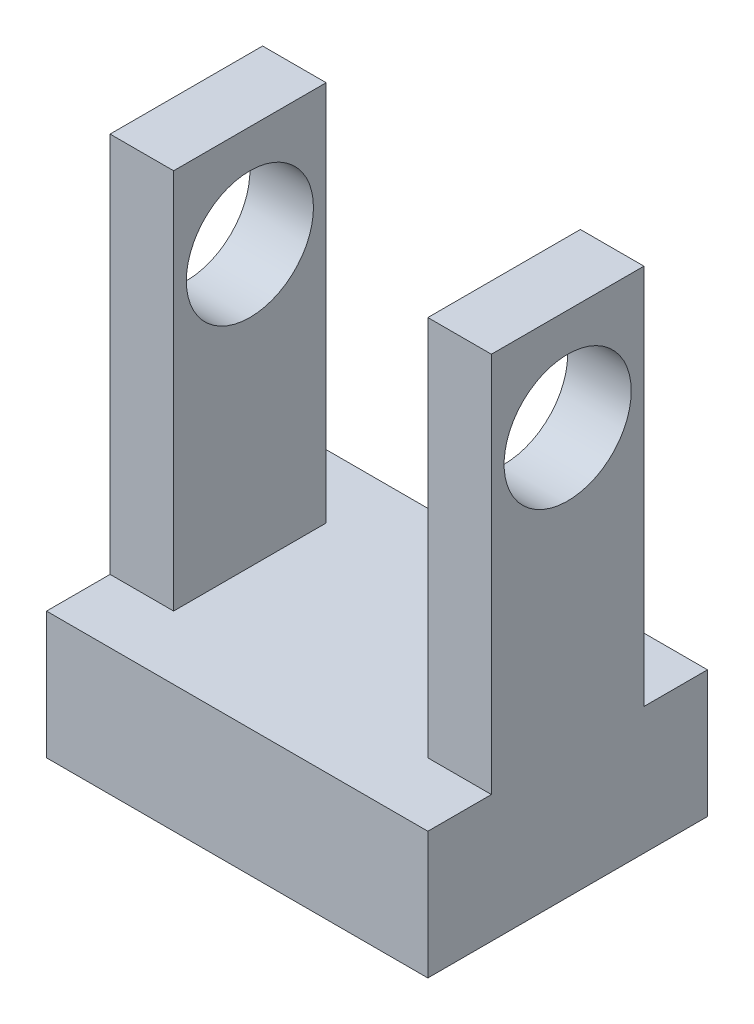
ISO-10303-21;
HEADER;
FILE_DESCRIPTION(('STEP AP214'),'2;1');
FILE_NAME('part.step','',(''),(''),'','','');
FILE_SCHEMA(('AUTOMOTIVE_DESIGN { 1 0 10303 214 1 1 1 1 }'));
ENDSEC;
DATA;
#1=APPLICATION_CONTEXT('core data for automotive mechanical design processes');
#2=APPLICATION_PROTOCOL_DEFINITION('international standard','automotive_design',2000,#1);
#3=PRODUCT_CONTEXT('',#1,'mechanical');
#4=PRODUCT('Part','Part','',(#3));
#5=PRODUCT_RELATED_PRODUCT_CATEGORY('part','',(#4));
#6=PRODUCT_DEFINITION_FORMATION('','',#4);
#7=PRODUCT_DEFINITION_CONTEXT('part definition',#1,'design');
#8=PRODUCT_DEFINITION('design','',#6,#7);
#9=PRODUCT_DEFINITION_SHAPE('','',#8);
#10=(LENGTH_UNIT() NAMED_UNIT(*) SI_UNIT(.MILLI.,.METRE.));
#11=(NAMED_UNIT(*) PLANE_ANGLE_UNIT() SI_UNIT($,.RADIAN.));
#12=(NAMED_UNIT(*) SI_UNIT($,.STERADIAN.) SOLID_ANGLE_UNIT());
#13=UNCERTAINTY_MEASURE_WITH_UNIT(LENGTH_MEASURE(1.E-05),#10,'distance_accuracy_value','');
#14=(GEOMETRIC_REPRESENTATION_CONTEXT(3) GLOBAL_UNCERTAINTY_ASSIGNED_CONTEXT((#13)) GLOBAL_UNIT_ASSIGNED_CONTEXT((#10,
#11,#12)) REPRESENTATION_CONTEXT('',''));
#15=CARTESIAN_POINT('',(0.,0.,0.));
#16=DIRECTION('',(0.,0.,1.));
#17=DIRECTION('',(1.,0.,0.));
#18=AXIS2_PLACEMENT_3D('',#15,#16,#17);
#19=CARTESIAN_POINT('',(0.,10.,0.));
#20=DIRECTION('',(0.,1.,0.));
#21=DIRECTION('',(0.,0.,1.));
#22=AXIS2_PLACEMENT_3D('',#19,#20,#21);
#23=PLANE('',#22);
#24=DIRECTION('',(0.,0.,-1.));
#25=VECTOR('',#24,1.);
#26=CARTESIAN_POINT('',(-40.6375629446881,10.,0.));
#27=LINE('',#26,#25);
#28=CARTESIAN_POINT('',(-40.6375629446881,10.,46.2633768400208));
#29=VERTEX_POINT('',#28);
#30=CARTESIAN_POINT('',(-40.6375629446881,10.,34.2633768400208));
#31=VERTEX_POINT('',#30);
#32=EDGE_CURVE('E152',#29,#31,#27,.T.);
#33=ORIENTED_EDGE('',*,*,#32,.T.);
#34=DIRECTION('',(1.,0.,0.));
#35=VECTOR('',#34,1.);
#36=CARTESIAN_POINT('',(0.,10.,34.2633768400208));
#37=LINE('',#36,#35);
#38=CARTESIAN_POINT('',(-35.6375629446881,10.,34.2633768400208));
#39=VERTEX_POINT('',#38);
#40=EDGE_CURVE('E155',#31,#39,#37,.T.);
#41=ORIENTED_EDGE('',*,*,#40,.T.);
#42=DIRECTION('',(0.,0.,1.));
#43=VECTOR('',#42,1.);
#44=CARTESIAN_POINT('',(-35.6375629446881,10.,29.2633768400208));
#45=LINE('',#44,#43);
#46=CARTESIAN_POINT('',(-35.6375629446881,10.,29.2633768400208));
#47=VERTEX_POINT('',#46);
#48=EDGE_CURVE('E128',#47,#39,#45,.T.);
#49=ORIENTED_EDGE('',*,*,#48,.F.);
#50=DIRECTION('',(1.,0.,0.));
#51=VECTOR('',#50,1.);
#52=CARTESIAN_POINT('',(-65.6375629446881,10.,29.2633768400208));
#53=LINE('',#52,#51);
#54=CARTESIAN_POINT('',(-65.6375629446881,10.,29.2633768400208));
#55=VERTEX_POINT('',#54);
#56=EDGE_CURVE('E194',#55,#47,#53,.T.);
#57=ORIENTED_EDGE('',*,*,#56,.F.);
#58=DIRECTION('',(0.,0.,1.));
#59=VECTOR('',#58,1.);
#60=CARTESIAN_POINT('',(-65.6375629446881,10.,29.2633768400208));
#61=LINE('',#60,#59);
#62=CARTESIAN_POINT('',(-65.6375629446881,10.,34.2633768400208));
#63=VERTEX_POINT('',#62);
#64=EDGE_CURVE('E186',#55,#63,#61,.T.);
#65=ORIENTED_EDGE('',*,*,#64,.T.);
#66=DIRECTION('',(-1.,0.,0.));
#67=VECTOR('',#66,1.);
#68=CARTESIAN_POINT('',(0.,10.,34.2633768400207));
#69=LINE('',#68,#67);
#70=CARTESIAN_POINT('',(-60.6375629446881,10.,34.2633768400208));
#71=VERTEX_POINT('',#70);
#72=EDGE_CURVE('E182',#71,#63,#69,.T.);
#73=ORIENTED_EDGE('',*,*,#72,.F.);
#74=DIRECTION('',(0.,0.,-1.));
#75=VECTOR('',#74,1.);
#76=CARTESIAN_POINT('',(-60.6375629446881,10.,0.));
#77=LINE('',#76,#75);
#78=CARTESIAN_POINT('',(-60.6375629446881,10.,46.2633768400208));
#79=VERTEX_POINT('',#78);
#80=EDGE_CURVE('E57',#79,#71,#77,.T.);
#81=ORIENTED_EDGE('',*,*,#80,.F.);
#82=DIRECTION('',(-1.,0.,0.));
#83=VECTOR('',#82,1.);
#84=CARTESIAN_POINT('',(0.,10.,46.2633768400208));
#85=LINE('',#84,#83);
#86=CARTESIAN_POINT('',(-65.6375629446881,10.,46.2633768400208));
#87=VERTEX_POINT('',#86);
#88=EDGE_CURVE('E180',#79,#87,#85,.T.);
#89=ORIENTED_EDGE('',*,*,#88,.T.);
#90=CARTESIAN_POINT('',(-65.6375629446881,10.,51.2633768400208));
#91=VERTEX_POINT('',#90);
#92=EDGE_CURVE('E189',#87,#91,#61,.T.);
#93=ORIENTED_EDGE('',*,*,#92,.T.);
#94=DIRECTION('',(1.,0.,0.));
#95=VECTOR('',#94,1.);
#96=CARTESIAN_POINT('',(-65.6375629446881,10.,51.2633768400208));
#97=LINE('',#96,#95);
#98=CARTESIAN_POINT('',(-35.6375629446881,10.,51.2633768400208));
#99=VERTEX_POINT('',#98);
#100=EDGE_CURVE('E188',#91,#99,#97,.T.);
#101=ORIENTED_EDGE('',*,*,#100,.T.);
#102=CARTESIAN_POINT('',(-35.6375629446881,10.,46.2633768400208));
#103=VERTEX_POINT('',#102);
#104=EDGE_CURVE('E192',#103,#99,#45,.T.);
#105=ORIENTED_EDGE('',*,*,#104,.F.);
#106=DIRECTION('',(1.,0.,0.));
#107=VECTOR('',#106,1.);
#108=CARTESIAN_POINT('',(0.,10.,46.2633768400208));
#109=LINE('',#108,#107);
#110=EDGE_CURVE('E139',#29,#103,#109,.T.);
#111=ORIENTED_EDGE('',*,*,#110,.F.);
#112=EDGE_LOOP('',(#33,#41,#49,#57,#65,#73,#81,#89,#93,#101,#105,#111));
#113=FACE_BOUND('',#112,.T.);
#114=ADVANCED_FACE('F33',(#113),#23,.T.);
#115=CARTESIAN_POINT('',(-65.6375629446881,10.,29.2633768400208));
#116=DIRECTION('',(1.,0.,0.));
#117=DIRECTION('',(0.,0.,-1.));
#118=AXIS2_PLACEMENT_3D('',#115,#116,#117);
#119=PLANE('',#118);
#120=CARTESIAN_POINT('',(-65.6375629446881,32.,40.2633768400208));
#121=DIRECTION('',(-1.,0.,0.));
#122=DIRECTION('',(0.,0.,1.));
#123=AXIS2_PLACEMENT_3D('',#120,#121,#122);
#124=CIRCLE('',#123,5.);
#125=CARTESIAN_POINT('',(-65.6375629446881,32.,45.2633768400208));
#126=VERTEX_POINT('',#125);
#127=EDGE_CURVE('E241',#126,#126,#124,.T.);
#128=ORIENTED_EDGE('',*,*,#127,.F.);
#129=EDGE_LOOP('',(#128));
#130=FACE_BOUND('',#129,.T.);
#131=DIRECTION('',(0.,0.,1.));
#132=VECTOR('',#131,1.);
#133=CARTESIAN_POINT('',(-65.6375629446881,0.,29.2633768400208));
#134=LINE('',#133,#132);
#135=CARTESIAN_POINT('',(-65.6375629446881,0.,29.2633768400208));
#136=VERTEX_POINT('',#135);
#137=CARTESIAN_POINT('',(-65.6375629446881,0.,51.2633768400208));
#138=VERTEX_POINT('',#137);
#139=EDGE_CURVE('E185',#136,#138,#134,.T.);
#140=ORIENTED_EDGE('',*,*,#139,.T.);
#141=DIRECTION('',(0.,-1.,0.));
#142=VECTOR('',#141,1.);
#143=CARTESIAN_POINT('',(-65.6375629446881,10.,51.2633768400208));
#144=LINE('',#143,#142);
#145=EDGE_CURVE('E11',#91,#138,#144,.T.);
#146=ORIENTED_EDGE('',*,*,#145,.F.);
#147=ORIENTED_EDGE('',*,*,#92,.F.);
#148=DIRECTION('',(0.,-1.,0.));
#149=VECTOR('',#148,1.);
#150=CARTESIAN_POINT('',(-65.6375629446881,40.,46.2633768400208));
#151=LINE('',#150,#149);
#152=CARTESIAN_POINT('',(-65.6375629446881,40.,46.2633768400208));
#153=VERTEX_POINT('',#152);
#154=EDGE_CURVE('E171',#153,#87,#151,.T.);
#155=ORIENTED_EDGE('',*,*,#154,.F.);
#156=DIRECTION('',(0.,0.,1.));
#157=VECTOR('',#156,1.);
#158=CARTESIAN_POINT('',(-65.6375629446881,40.,34.2633768400208));
#159=LINE('',#158,#157);
#160=CARTESIAN_POINT('',(-65.6375629446881,40.,34.2633768400208));
#161=VERTEX_POINT('',#160);
#162=EDGE_CURVE('E165',#161,#153,#159,.T.);
#163=ORIENTED_EDGE('',*,*,#162,.F.);
#164=DIRECTION('',(0.,-1.,0.));
#165=VECTOR('',#164,1.);
#166=CARTESIAN_POINT('',(-65.6375629446881,40.,34.2633768400208));
#167=LINE('',#166,#165);
#168=EDGE_CURVE('E168',#161,#63,#167,.T.);
#169=ORIENTED_EDGE('',*,*,#168,.T.);
#170=ORIENTED_EDGE('',*,*,#64,.F.);
#171=DIRECTION('',(0.,-1.,0.));
#172=VECTOR('',#171,1.);
#173=CARTESIAN_POINT('',(-65.6375629446881,10.,29.2633768400208));
#174=LINE('',#173,#172);
#175=EDGE_CURVE('E197',#55,#136,#174,.T.);
#176=ORIENTED_EDGE('',*,*,#175,.T.);
#177=EDGE_LOOP('',(#140,#146,#147,#155,#163,#169,#170,#176));
#178=FACE_BOUND('',#177,.T.);
#179=ADVANCED_FACE('F35',(#130,#178),#119,.F.);
#180=CARTESIAN_POINT('',(-65.6375629446881,10.,51.2633768400208));
#181=DIRECTION('',(0.,0.,-1.));
#182=DIRECTION('',(-1.,0.,0.));
#183=AXIS2_PLACEMENT_3D('',#180,#181,#182);
#184=PLANE('',#183);
#185=DIRECTION('',(1.,0.,0.));
#186=VECTOR('',#185,1.);
#187=CARTESIAN_POINT('',(-65.6375629446881,0.,51.2633768400208));
#188=LINE('',#187,#186);
#189=CARTESIAN_POINT('',(-35.6375629446881,0.,51.2633768400208));
#190=VERTEX_POINT('',#189);
#191=EDGE_CURVE('E199',#138,#190,#188,.T.);
#192=ORIENTED_EDGE('',*,*,#191,.T.);
#193=DIRECTION('',(0.,-1.,0.));
#194=VECTOR('',#193,1.);
#195=CARTESIAN_POINT('',(-35.6375629446881,10.,51.2633768400208));
#196=LINE('',#195,#194);
#197=EDGE_CURVE('E42',#99,#190,#196,.T.);
#198=ORIENTED_EDGE('',*,*,#197,.F.);
#199=ORIENTED_EDGE('',*,*,#100,.F.);
#200=ORIENTED_EDGE('',*,*,#145,.T.);
#201=EDGE_LOOP('',(#192,#198,#199,#200));
#202=FACE_BOUND('',#201,.T.);
#203=ADVANCED_FACE('F216',(#202),#184,.F.);
#204=CARTESIAN_POINT('',(-35.6375629446881,10.,29.2633768400208));
#205=DIRECTION('',(1.,0.,0.));
#206=DIRECTION('',(0.,0.,-1.));
#207=AXIS2_PLACEMENT_3D('',#204,#205,#206);
#208=PLANE('',#207);
#209=CARTESIAN_POINT('',(-35.6375629446881,32.,40.2633768400208));
#210=DIRECTION('',(1.,0.,0.));
#211=DIRECTION('',(0.,0.,-1.));
#212=AXIS2_PLACEMENT_3D('',#209,#210,#211);
#213=CIRCLE('',#212,5.);
#214=CARTESIAN_POINT('',(-35.6375629446881,32.,35.2633768400208));
#215=VERTEX_POINT('',#214);
#216=EDGE_CURVE('E232',#215,#215,#213,.T.);
#217=ORIENTED_EDGE('',*,*,#216,.F.);
#218=EDGE_LOOP('',(#217));
#219=FACE_BOUND('',#218,.T.);
#220=ORIENTED_EDGE('',*,*,#197,.T.);
#221=DIRECTION('',(0.,0.,1.));
#222=VECTOR('',#221,1.);
#223=CARTESIAN_POINT('',(-35.6375629446881,0.,29.2633768400208));
#224=LINE('',#223,#222);
#225=CARTESIAN_POINT('',(-35.6375629446881,0.,29.2633768400208));
#226=VERTEX_POINT('',#225);
#227=EDGE_CURVE('E202',#226,#190,#224,.T.);
#228=ORIENTED_EDGE('',*,*,#227,.F.);
#229=DIRECTION('',(0.,-1.,0.));
#230=VECTOR('',#229,1.);
#231=CARTESIAN_POINT('',(-35.6375629446881,10.,29.2633768400208));
#232=LINE('',#231,#230);
#233=EDGE_CURVE('E208',#47,#226,#232,.T.);
#234=ORIENTED_EDGE('',*,*,#233,.F.);
#235=ORIENTED_EDGE('',*,*,#48,.T.);
#236=DIRECTION('',(0.,-1.,0.));
#237=VECTOR('',#236,1.);
#238=CARTESIAN_POINT('',(-35.6375629446881,40.,34.2633768400208));
#239=LINE('',#238,#237);
#240=CARTESIAN_POINT('',(-35.6375629446881,40.,34.2633768400208));
#241=VERTEX_POINT('',#240);
#242=EDGE_CURVE('E121',#241,#39,#239,.T.);
#243=ORIENTED_EDGE('',*,*,#242,.F.);
#244=DIRECTION('',(0.,0.,1.));
#245=VECTOR('',#244,1.);
#246=CARTESIAN_POINT('',(-35.6375629446881,40.,34.2633768400208));
#247=LINE('',#246,#245);
#248=CARTESIAN_POINT('',(-35.6375629446881,40.,46.2633768400208));
#249=VERTEX_POINT('',#248);
#250=EDGE_CURVE('E126',#241,#249,#247,.T.);
#251=ORIENTED_EDGE('',*,*,#250,.T.);
#252=DIRECTION('',(0.,-1.,0.));
#253=VECTOR('',#252,1.);
#254=CARTESIAN_POINT('',(-35.6375629446881,40.,46.2633768400208));
#255=LINE('',#254,#253);
#256=EDGE_CURVE('E49',#249,#103,#255,.T.);
#257=ORIENTED_EDGE('',*,*,#256,.T.);
#258=ORIENTED_EDGE('',*,*,#104,.T.);
#259=EDGE_LOOP('',(#220,#228,#234,#235,#243,#251,#257,#258));
#260=FACE_BOUND('',#259,.T.);
#261=ADVANCED_FACE('F124',(#219,#260),#208,.T.);
#262=CARTESIAN_POINT('',(-65.6375629446881,10.,29.2633768400208));
#263=DIRECTION('',(0.,0.,-1.));
#264=DIRECTION('',(-1.,0.,0.));
#265=AXIS2_PLACEMENT_3D('',#262,#263,#264);
#266=PLANE('',#265);
#267=DIRECTION('',(1.,0.,0.));
#268=VECTOR('',#267,1.);
#269=CARTESIAN_POINT('',(-65.6375629446881,0.,29.2633768400208));
#270=LINE('',#269,#268);
#271=EDGE_CURVE('E204',#136,#226,#270,.T.);
#272=ORIENTED_EDGE('',*,*,#271,.F.);
#273=ORIENTED_EDGE('',*,*,#175,.F.);
#274=ORIENTED_EDGE('',*,*,#56,.T.);
#275=ORIENTED_EDGE('',*,*,#233,.T.);
#276=EDGE_LOOP('',(#272,#273,#274,#275));
#277=FACE_BOUND('',#276,.T.);
#278=ADVANCED_FACE('F223',(#277),#266,.T.);
#279=CARTESIAN_POINT('',(0.,0.,0.));
#280=DIRECTION('',(0.,1.,0.));
#281=DIRECTION('',(0.,0.,1.));
#282=AXIS2_PLACEMENT_3D('',#279,#280,#281);
#283=PLANE('',#282);
#284=ORIENTED_EDGE('',*,*,#227,.T.);
#285=ORIENTED_EDGE('',*,*,#191,.F.);
#286=ORIENTED_EDGE('',*,*,#139,.F.);
#287=ORIENTED_EDGE('',*,*,#271,.T.);
#288=EDGE_LOOP('',(#284,#285,#286,#287));
#289=FACE_BOUND('',#288,.T.);
#290=ADVANCED_FACE('F220',(#289),#283,.F.);
#291=CARTESIAN_POINT('',(-65.6375629446881,40.,34.2633768400208));
#292=DIRECTION('',(0.,0.,-1.));
#293=DIRECTION('',(-1.,0.,0.));
#294=AXIS2_PLACEMENT_3D('',#291,#292,#293);
#295=PLANE('',#294);
#296=DIRECTION('',(0.,-1.,0.));
#297=VECTOR('',#296,1.);
#298=CARTESIAN_POINT('',(-60.6375629446881,40.,34.2633768400208));
#299=LINE('',#298,#297);
#300=CARTESIAN_POINT('',(-60.6375629446881,40.,34.2633768400208));
#301=VERTEX_POINT('',#300);
#302=EDGE_CURVE('E167',#301,#71,#299,.T.);
#303=ORIENTED_EDGE('',*,*,#302,.T.);
#304=ORIENTED_EDGE('',*,*,#72,.T.);
#305=ORIENTED_EDGE('',*,*,#168,.F.);
#306=DIRECTION('',(1.,0.,0.));
#307=VECTOR('',#306,1.);
#308=CARTESIAN_POINT('',(-65.6375629446881,40.,34.2633768400208));
#309=LINE('',#308,#307);
#310=EDGE_CURVE('E157',#161,#301,#309,.T.);
#311=ORIENTED_EDGE('',*,*,#310,.T.);
#312=EDGE_LOOP('',(#303,#304,#305,#311));
#313=FACE_BOUND('',#312,.T.);
#314=ADVANCED_FACE('F270',(#313),#295,.T.);
#315=CARTESIAN_POINT('',(-65.6375629446881,40.,46.2633768400208));
#316=DIRECTION('',(0.,0.,-1.));
#317=DIRECTION('',(-1.,0.,0.));
#318=AXIS2_PLACEMENT_3D('',#315,#316,#317);
#319=PLANE('',#318);
#320=ORIENTED_EDGE('',*,*,#88,.F.);
#321=DIRECTION('',(0.,-1.,0.));
#322=VECTOR('',#321,1.);
#323=CARTESIAN_POINT('',(-60.6375629446881,40.,46.2633768400208));
#324=LINE('',#323,#322);
#325=CARTESIAN_POINT('',(-60.6375629446881,40.,46.2633768400208));
#326=VERTEX_POINT('',#325);
#327=EDGE_CURVE('E174',#326,#79,#324,.T.);
#328=ORIENTED_EDGE('',*,*,#327,.F.);
#329=DIRECTION('',(1.,0.,0.));
#330=VECTOR('',#329,1.);
#331=CARTESIAN_POINT('',(-65.6375629446881,40.,46.2633768400208));
#332=LINE('',#331,#330);
#333=EDGE_CURVE('E163',#153,#326,#332,.T.);
#334=ORIENTED_EDGE('',*,*,#333,.F.);
#335=ORIENTED_EDGE('',*,*,#154,.T.);
#336=EDGE_LOOP('',(#320,#328,#334,#335));
#337=FACE_BOUND('',#336,.T.);
#338=ADVANCED_FACE('F302',(#337),#319,.F.);
#339=CARTESIAN_POINT('',(-60.6375629446881,40.,34.2633768400208));
#340=DIRECTION('',(1.,0.,0.));
#341=DIRECTION('',(0.,0.,-1.));
#342=AXIS2_PLACEMENT_3D('',#339,#340,#341);
#343=PLANE('',#342);
#344=CARTESIAN_POINT('',(-60.6375629446881,32.,40.2633768400208));
#345=DIRECTION('',(1.,0.,0.));
#346=DIRECTION('',(0.,0.,-1.));
#347=AXIS2_PLACEMENT_3D('',#344,#345,#346);
#348=CIRCLE('',#347,5.);
#349=CARTESIAN_POINT('',(-60.6375629446881,32.,35.2633768400208));
#350=VERTEX_POINT('',#349);
#351=EDGE_CURVE('E236',#350,#350,#348,.T.);
#352=ORIENTED_EDGE('',*,*,#351,.F.);
#353=EDGE_LOOP('',(#352));
#354=FACE_BOUND('',#353,.T.);
#355=ORIENTED_EDGE('',*,*,#327,.T.);
#356=ORIENTED_EDGE('',*,*,#80,.T.);
#357=ORIENTED_EDGE('',*,*,#302,.F.);
#358=DIRECTION('',(0.,0.,1.));
#359=VECTOR('',#358,1.);
#360=CARTESIAN_POINT('',(-60.6375629446881,40.,34.2633768400208));
#361=LINE('',#360,#359);
#362=EDGE_CURVE('E160',#301,#326,#361,.T.);
#363=ORIENTED_EDGE('',*,*,#362,.T.);
#364=EDGE_LOOP('',(#355,#356,#357,#363));
#365=FACE_BOUND('',#364,.T.);
#366=ADVANCED_FACE('F309',(#354,#365),#343,.T.);
#367=CARTESIAN_POINT('',(0.,40.,0.));
#368=DIRECTION('',(0.,-1.,0.));
#369=DIRECTION('',(0.,0.,-1.));
#370=AXIS2_PLACEMENT_3D('',#367,#368,#369);
#371=PLANE('',#370);
#372=ORIENTED_EDGE('',*,*,#310,.F.);
#373=ORIENTED_EDGE('',*,*,#162,.T.);
#374=ORIENTED_EDGE('',*,*,#333,.T.);
#375=ORIENTED_EDGE('',*,*,#362,.F.);
#376=EDGE_LOOP('',(#372,#373,#374,#375));
#377=FACE_BOUND('',#376,.T.);
#378=ADVANCED_FACE('F317',(#377),#371,.F.);
#379=CARTESIAN_POINT('',(-35.6375629446881,40.,34.2633768400208));
#380=DIRECTION('',(0.,0.,1.));
#381=DIRECTION('',(1.,0.,0.));
#382=AXIS2_PLACEMENT_3D('',#379,#380,#381);
#383=PLANE('',#382);
#384=ORIENTED_EDGE('',*,*,#40,.F.);
#385=DIRECTION('',(0.,-1.,0.));
#386=VECTOR('',#385,1.);
#387=CARTESIAN_POINT('',(-40.6375629446881,40.,34.2633768400208));
#388=LINE('',#387,#386);
#389=CARTESIAN_POINT('',(-40.6375629446881,40.,34.2633768400208));
#390=VERTEX_POINT('',#389);
#391=EDGE_CURVE('E137',#390,#31,#388,.T.);
#392=ORIENTED_EDGE('',*,*,#391,.F.);
#393=DIRECTION('',(-1.,0.,0.));
#394=VECTOR('',#393,1.);
#395=CARTESIAN_POINT('',(-35.6375629446881,40.,34.2633768400208));
#396=LINE('',#395,#394);
#397=EDGE_CURVE('E134',#241,#390,#396,.T.);
#398=ORIENTED_EDGE('',*,*,#397,.F.);
#399=ORIENTED_EDGE('',*,*,#242,.T.);
#400=EDGE_LOOP('',(#384,#392,#398,#399));
#401=FACE_BOUND('',#400,.T.);
#402=ADVANCED_FACE('F135',(#401),#383,.F.);
#403=CARTESIAN_POINT('',(-40.6375629446881,40.,34.2633768400208));
#404=DIRECTION('',(1.,0.,0.));
#405=DIRECTION('',(0.,0.,-1.));
#406=AXIS2_PLACEMENT_3D('',#403,#404,#405);
#407=PLANE('',#406);
#408=CARTESIAN_POINT('',(-40.6375629446881,32.,40.2633768400208));
#409=DIRECTION('',(1.,0.,0.));
#410=DIRECTION('',(0.,0.,-1.));
#411=AXIS2_PLACEMENT_3D('',#408,#409,#410);
#412=CIRCLE('',#411,5.);
#413=CARTESIAN_POINT('',(-40.6375629446881,32.,35.2633768400208));
#414=VERTEX_POINT('',#413);
#415=EDGE_CURVE('E37',#414,#414,#412,.T.);
#416=ORIENTED_EDGE('',*,*,#415,.T.);
#417=EDGE_LOOP('',(#416));
#418=FACE_BOUND('',#417,.T.);
#419=ORIENTED_EDGE('',*,*,#32,.F.);
#420=DIRECTION('',(0.,-1.,0.));
#421=VECTOR('',#420,1.);
#422=CARTESIAN_POINT('',(-40.6375629446881,40.,46.2633768400208));
#423=LINE('',#422,#421);
#424=CARTESIAN_POINT('',(-40.6375629446881,40.,46.2633768400208));
#425=VERTEX_POINT('',#424);
#426=EDGE_CURVE('E231',#425,#29,#423,.T.);
#427=ORIENTED_EDGE('',*,*,#426,.F.);
#428=DIRECTION('',(0.,0.,1.));
#429=VECTOR('',#428,1.);
#430=CARTESIAN_POINT('',(-40.6375629446881,40.,34.2633768400208));
#431=LINE('',#430,#429);
#432=EDGE_CURVE('E140',#390,#425,#431,.T.);
#433=ORIENTED_EDGE('',*,*,#432,.F.);
#434=ORIENTED_EDGE('',*,*,#391,.T.);
#435=EDGE_LOOP('',(#419,#427,#433,#434));
#436=FACE_BOUND('',#435,.T.);
#437=ADVANCED_FACE('F228',(#418,#436),#407,.F.);
#438=CARTESIAN_POINT('',(-35.6375629446881,40.,46.2633768400208));
#439=DIRECTION('',(0.,0.,1.));
#440=DIRECTION('',(1.,0.,0.));
#441=AXIS2_PLACEMENT_3D('',#438,#439,#440);
#442=PLANE('',#441);
#443=ORIENTED_EDGE('',*,*,#426,.T.);
#444=ORIENTED_EDGE('',*,*,#110,.T.);
#445=ORIENTED_EDGE('',*,*,#256,.F.);
#446=DIRECTION('',(-1.,0.,0.));
#447=VECTOR('',#446,1.);
#448=CARTESIAN_POINT('',(-35.6375629446881,40.,46.2633768400208));
#449=LINE('',#448,#447);
#450=EDGE_CURVE('E145',#249,#425,#449,.T.);
#451=ORIENTED_EDGE('',*,*,#450,.T.);
#452=EDGE_LOOP('',(#443,#444,#445,#451));
#453=FACE_BOUND('',#452,.T.);
#454=ADVANCED_FACE('F259',(#453),#442,.T.);
#455=CARTESIAN_POINT('',(0.,40.,0.));
#456=DIRECTION('',(0.,1.,0.));
#457=DIRECTION('',(0.,0.,1.));
#458=AXIS2_PLACEMENT_3D('',#455,#456,#457);
#459=PLANE('',#458);
#460=ORIENTED_EDGE('',*,*,#397,.T.);
#461=ORIENTED_EDGE('',*,*,#432,.T.);
#462=ORIENTED_EDGE('',*,*,#450,.F.);
#463=ORIENTED_EDGE('',*,*,#250,.F.);
#464=EDGE_LOOP('',(#460,#461,#462,#463));
#465=FACE_BOUND('',#464,.T.);
#466=ADVANCED_FACE('F143',(#465),#459,.T.);
#467=CARTESIAN_POINT('',(-25.6375629446881,32.,40.2633768400208));
#468=DIRECTION('',(-1.,0.,0.));
#469=DIRECTION('',(0.,0.,1.));
#470=AXIS2_PLACEMENT_3D('',#467,#468,#469);
#471=CYLINDRICAL_SURFACE('',#470,5.);
#472=ORIENTED_EDGE('',*,*,#216,.T.);
#473=EDGE_LOOP('',(#472));
#474=FACE_BOUND('',#473,.T.);
#475=ORIENTED_EDGE('',*,*,#415,.F.);
#476=EDGE_LOOP('',(#475));
#477=FACE_BOUND('',#476,.T.);
#478=ADVANCED_FACE('F249',(#474,#477),#471,.F.);
#479=ORIENTED_EDGE('',*,*,#351,.T.);
#480=EDGE_LOOP('',(#479));
#481=FACE_BOUND('',#480,.T.);
#482=ORIENTED_EDGE('',*,*,#127,.T.);
#483=EDGE_LOOP('',(#482));
#484=FACE_BOUND('',#483,.T.);
#485=ADVANCED_FACE('F251',(#481,#484),#471,.F.);
#486=CLOSED_SHELL('',(#114,#179,#203,#261,#278,#290,#314,#338,#366,#378,#402,#437,#454,#466,
#478,#485));
#487=MANIFOLD_SOLID_BREP('B2',#486);
#488=ADVANCED_BREP_SHAPE_REPRESENTATION('',(#18,#487),#14);
#489=SHAPE_DEFINITION_REPRESENTATION(#9,#488);
ENDSEC;
END-ISO-10303-21;
